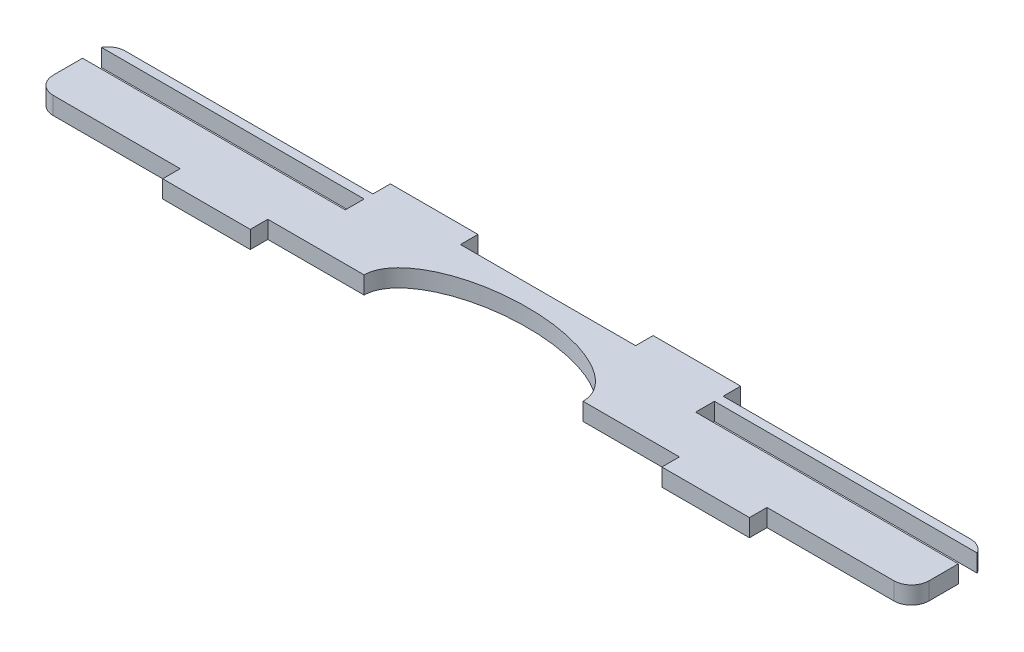
ISO-10303-21;
HEADER;
FILE_DESCRIPTION(('STEP AP214'),'2;1');
FILE_NAME('part.step','',(''),(''),'','','');
FILE_SCHEMA(('AUTOMOTIVE_DESIGN { 1 0 10303 214 1 1 1 1 }'));
ENDSEC;
DATA;
#1=APPLICATION_CONTEXT('core data for automotive mechanical design processes');
#2=APPLICATION_PROTOCOL_DEFINITION('international standard','automotive_design',2000,#1);
#3=PRODUCT_CONTEXT('',#1,'mechanical');
#4=PRODUCT('Part','Part','',(#3));
#5=PRODUCT_RELATED_PRODUCT_CATEGORY('part','',(#4));
#6=PRODUCT_DEFINITION_FORMATION('','',#4);
#7=PRODUCT_DEFINITION_CONTEXT('part definition',#1,'design');
#8=PRODUCT_DEFINITION('design','',#6,#7);
#9=PRODUCT_DEFINITION_SHAPE('','',#8);
#10=(LENGTH_UNIT() NAMED_UNIT(*) SI_UNIT(.MILLI.,.METRE.));
#11=(NAMED_UNIT(*) PLANE_ANGLE_UNIT() SI_UNIT($,.RADIAN.));
#12=(NAMED_UNIT(*) SI_UNIT($,.STERADIAN.) SOLID_ANGLE_UNIT());
#13=UNCERTAINTY_MEASURE_WITH_UNIT(LENGTH_MEASURE(1.E-05),#10,'distance_accuracy_value','');
#14=(GEOMETRIC_REPRESENTATION_CONTEXT(3) GLOBAL_UNCERTAINTY_ASSIGNED_CONTEXT((#13)) GLOBAL_UNIT_ASSIGNED_CONTEXT((#10,
#11,#12)) REPRESENTATION_CONTEXT('',''));
#15=CARTESIAN_POINT('',(0.,0.,0.));
#16=DIRECTION('',(0.,0.,1.));
#17=DIRECTION('',(1.,0.,0.));
#18=AXIS2_PLACEMENT_3D('',#15,#16,#17);
#19=CARTESIAN_POINT('',(-127.,5.08,10.795));
#20=DIRECTION('',(0.,0.,-1.));
#21=DIRECTION('',(-1.,0.,0.));
#22=AXIS2_PLACEMENT_3D('',#19,#20,#21);
#23=PLANE('',#22);
#24=DIRECTION('',(1.,0.,0.));
#25=VECTOR('',#24,1.);
#26=CARTESIAN_POINT('',(-127.,5.08,10.795));
#27=LINE('',#26,#25);
#28=CARTESIAN_POINT('',(85.09,5.08,10.795));
#29=VERTEX_POINT('',#28);
#30=CARTESIAN_POINT('',(121.92,5.08,10.795));
#31=VERTEX_POINT('',#30);
#32=EDGE_CURVE('E48',#29,#31,#27,.T.);
#33=ORIENTED_EDGE('',*,*,#32,.F.);
#34=DIRECTION('',(0.,-1.,0.));
#35=VECTOR('',#34,1.);
#36=CARTESIAN_POINT('',(85.09,5.08,10.795));
#37=LINE('',#36,#35);
#38=CARTESIAN_POINT('',(85.09,0.,10.795));
#39=VERTEX_POINT('',#38);
#40=EDGE_CURVE('E249',#29,#39,#37,.T.);
#41=ORIENTED_EDGE('',*,*,#40,.T.);
#42=DIRECTION('',(1.,0.,0.));
#43=VECTOR('',#42,1.);
#44=CARTESIAN_POINT('',(-127.,0.,10.795));
#45=LINE('',#44,#43);
#46=CARTESIAN_POINT('',(121.92,0.,10.795));
#47=VERTEX_POINT('',#46);
#48=EDGE_CURVE('E442',#39,#47,#45,.T.);
#49=ORIENTED_EDGE('',*,*,#48,.T.);
#50=DIRECTION('',(0.,-1.,0.));
#51=VECTOR('',#50,1.);
#52=CARTESIAN_POINT('',(121.92,5.08,10.795));
#53=LINE('',#52,#51);
#54=EDGE_CURVE('E510',#47,#31,#53,.F.);
#55=ORIENTED_EDGE('',*,*,#54,.T.);
#56=EDGE_LOOP('',(#33,#41,#49,#55));
#57=FACE_BOUND('',#56,.T.);
#58=ADVANCED_FACE('F33',(#57),#23,.F.);
#59=CARTESIAN_POINT('',(127.,5.08,10.795));
#60=DIRECTION('',(-1.,0.,0.));
#61=DIRECTION('',(0.,0.,1.));
#62=AXIS2_PLACEMENT_3D('',#59,#60,#61);
#63=PLANE('',#62);
#64=DIRECTION('',(0.,0.,-1.));
#65=VECTOR('',#64,1.);
#66=CARTESIAN_POINT('',(127.,5.08,10.795));
#67=LINE('',#66,#65);
#68=CARTESIAN_POINT('',(127.,5.08,5.715));
#69=VERTEX_POINT('',#68);
#70=CARTESIAN_POINT('',(127.,5.08,-2.794));
#71=VERTEX_POINT('',#70);
#72=EDGE_CURVE('E526',#69,#71,#67,.T.);
#73=ORIENTED_EDGE('',*,*,#72,.F.);
#74=DIRECTION('',(0.,-1.,0.));
#75=VECTOR('',#74,1.);
#76=CARTESIAN_POINT('',(127.,5.08,5.715));
#77=LINE('',#76,#75);
#78=CARTESIAN_POINT('',(127.,0.,5.715));
#79=VERTEX_POINT('',#78);
#80=EDGE_CURVE('E507',#69,#79,#77,.T.);
#81=ORIENTED_EDGE('',*,*,#80,.T.);
#82=DIRECTION('',(0.,0.,-1.));
#83=VECTOR('',#82,1.);
#84=CARTESIAN_POINT('',(127.,0.,10.795));
#85=LINE('',#84,#83);
#86=CARTESIAN_POINT('',(127.,0.,-2.794));
#87=VERTEX_POINT('',#86);
#88=EDGE_CURVE('E538',#79,#87,#85,.T.);
#89=ORIENTED_EDGE('',*,*,#88,.T.);
#90=DIRECTION('',(0.,1.,0.));
#91=VECTOR('',#90,1.);
#92=CARTESIAN_POINT('',(127.,0.,-2.794));
#93=LINE('',#92,#91);
#94=EDGE_CURVE('E296',#87,#71,#93,.T.);
#95=ORIENTED_EDGE('',*,*,#94,.T.);
#96=EDGE_LOOP('',(#73,#81,#89,#95));
#97=FACE_BOUND('',#96,.T.);
#98=ADVANCED_FACE('F387',(#97),#63,.F.);
#99=CARTESIAN_POINT('',(0.,5.08,0.));
#100=DIRECTION('',(0.,-1.,0.));
#101=DIRECTION('',(0.,0.,-1.));
#102=AXIS2_PLACEMENT_3D('',#99,#100,#101);
#103=PLANE('',#102);
#104=DIRECTION('',(1.,0.,0.));
#105=VECTOR('',#104,1.);
#106=CARTESIAN_POINT('',(127.,5.08,-8.255));
#107=LINE('',#106,#105);
#108=CARTESIAN_POINT('',(50.8,5.08,-8.255));
#109=VERTEX_POINT('',#108);
#110=CARTESIAN_POINT('',(127.,5.08,-8.255));
#111=VERTEX_POINT('',#110);
#112=EDGE_CURVE('E252',#109,#111,#107,.T.);
#113=ORIENTED_EDGE('',*,*,#112,.T.);
#114=CARTESIAN_POINT('',(122.600590948775,5.08,-5.715));
#115=DIRECTION('',(0.,-1.,0.));
#116=DIRECTION('',(0.,0.,-1.));
#117=AXIS2_PLACEMENT_3D('',#114,#115,#116);
#118=CIRCLE('',#117,5.08);
#119=CARTESIAN_POINT('',(122.600590948775,5.08,-10.795));
#120=VERTEX_POINT('',#119);
#121=EDGE_CURVE('E505',#111,#120,#118,.F.);
#122=ORIENTED_EDGE('',*,*,#121,.T.);
#123=DIRECTION('',(-1.,0.,0.));
#124=VECTOR('',#123,1.);
#125=CARTESIAN_POINT('',(-127.,5.08,-10.795));
#126=LINE('',#125,#124);
#127=CARTESIAN_POINT('',(50.8,5.08,-10.795));
#128=VERTEX_POINT('',#127);
#129=EDGE_CURVE('E546',#120,#128,#126,.T.);
#130=ORIENTED_EDGE('',*,*,#129,.T.);
#131=DIRECTION('',(0.,0.,1.));
#132=VECTOR('',#131,1.);
#133=CARTESIAN_POINT('',(50.8,5.07999999999999,-15.875));
#134=LINE('',#133,#132);
#135=CARTESIAN_POINT('',(50.8,5.07999999999999,-15.875));
#136=VERTEX_POINT('',#135);
#137=EDGE_CURVE('E608',#136,#128,#134,.T.);
#138=ORIENTED_EDGE('',*,*,#137,.F.);
#139=DIRECTION('',(-1.,0.,0.));
#140=VECTOR('',#139,1.);
#141=CARTESIAN_POINT('',(50.8,5.07999999999999,-15.875));
#142=LINE('',#141,#140);
#143=CARTESIAN_POINT('',(25.4,5.07999999999999,-15.875));
#144=VERTEX_POINT('',#143);
#145=EDGE_CURVE('E611',#136,#144,#142,.T.);
#146=ORIENTED_EDGE('',*,*,#145,.T.);
#147=DIRECTION('',(0.,0.,1.));
#148=VECTOR('',#147,1.);
#149=CARTESIAN_POINT('',(25.4,5.07999999999999,-15.875));
#150=LINE('',#149,#148);
#151=CARTESIAN_POINT('',(25.4,5.08,-10.795));
#152=VERTEX_POINT('',#151);
#153=EDGE_CURVE('E605',#144,#152,#150,.T.);
#154=ORIENTED_EDGE('',*,*,#153,.T.);
#155=CARTESIAN_POINT('',(-25.4,5.08,-10.795));
#156=VERTEX_POINT('',#155);
#157=EDGE_CURVE('E547',#152,#156,#126,.T.);
#158=ORIENTED_EDGE('',*,*,#157,.T.);
#159=DIRECTION('',(0.,0.,1.));
#160=VECTOR('',#159,1.);
#161=CARTESIAN_POINT('',(-25.4,5.07999999999999,-15.875));
#162=LINE('',#161,#160);
#163=CARTESIAN_POINT('',(-25.4,5.07999999999999,-15.875));
#164=VERTEX_POINT('',#163);
#165=EDGE_CURVE('E551',#164,#156,#162,.T.);
#166=ORIENTED_EDGE('',*,*,#165,.F.);
#167=DIRECTION('',(1.,0.,0.));
#168=VECTOR('',#167,1.);
#169=CARTESIAN_POINT('',(-50.8,5.07999999999999,-15.875));
#170=LINE('',#169,#168);
#171=CARTESIAN_POINT('',(-50.8,5.07999999999999,-15.875));
#172=VERTEX_POINT('',#171);
#173=EDGE_CURVE('E571',#172,#164,#170,.T.);
#174=ORIENTED_EDGE('',*,*,#173,.F.);
#175=DIRECTION('',(0.,0.,1.));
#176=VECTOR('',#175,1.);
#177=CARTESIAN_POINT('',(-50.8,5.07999999999999,-15.875));
#178=LINE('',#177,#176);
#179=CARTESIAN_POINT('',(-50.8,5.08,-10.795));
#180=VERTEX_POINT('',#179);
#181=EDGE_CURVE('E540',#172,#180,#178,.T.);
#182=ORIENTED_EDGE('',*,*,#181,.T.);
#183=CARTESIAN_POINT('',(-122.600590948775,5.08,-10.795));
#184=VERTEX_POINT('',#183);
#185=EDGE_CURVE('E527',#180,#184,#126,.T.);
#186=ORIENTED_EDGE('',*,*,#185,.T.);
#187=CARTESIAN_POINT('',(-122.600590948775,5.08,-5.715));
#188=DIRECTION('',(0.,-1.,0.));
#189=DIRECTION('',(0.,0.,-1.));
#190=AXIS2_PLACEMENT_3D('',#187,#188,#189);
#191=CIRCLE('',#190,5.08);
#192=CARTESIAN_POINT('',(-127.,5.08,-8.255));
#193=VERTEX_POINT('',#192);
#194=EDGE_CURVE('E482',#184,#193,#191,.F.);
#195=ORIENTED_EDGE('',*,*,#194,.T.);
#196=DIRECTION('',(-1.,0.,0.));
#197=VECTOR('',#196,1.);
#198=CARTESIAN_POINT('',(-127.,5.08,-8.255));
#199=LINE('',#198,#197);
#200=CARTESIAN_POINT('',(-50.8,5.08,-8.255));
#201=VERTEX_POINT('',#200);
#202=EDGE_CURVE('E309',#201,#193,#199,.T.);
#203=ORIENTED_EDGE('',*,*,#202,.F.);
#204=DIRECTION('',(0.,0.,-1.));
#205=VECTOR('',#204,1.);
#206=CARTESIAN_POINT('',(-50.8,5.08,-8.255));
#207=LINE('',#206,#205);
#208=CARTESIAN_POINT('',(-50.8,5.08,-2.794));
#209=VERTEX_POINT('',#208);
#210=EDGE_CURVE('E318',#209,#201,#207,.T.);
#211=ORIENTED_EDGE('',*,*,#210,.F.);
#212=DIRECTION('',(1.,0.,0.));
#213=VECTOR('',#212,1.);
#214=CARTESIAN_POINT('',(-127.,5.08,-2.794));
#215=LINE('',#214,#213);
#216=CARTESIAN_POINT('',(-127.,5.08,-2.794));
#217=VERTEX_POINT('',#216);
#218=EDGE_CURVE('E299',#217,#209,#215,.T.);
#219=ORIENTED_EDGE('',*,*,#218,.F.);
#220=DIRECTION('',(0.,0.,1.));
#221=VECTOR('',#220,1.);
#222=CARTESIAN_POINT('',(-127.,5.08,10.795));
#223=LINE('',#222,#221);
#224=CARTESIAN_POINT('',(-127.,5.08,5.715));
#225=VERTEX_POINT('',#224);
#226=EDGE_CURVE('E543',#217,#225,#223,.T.);
#227=ORIENTED_EDGE('',*,*,#226,.T.);
#228=CARTESIAN_POINT('',(-121.92,5.08,5.715));
#229=DIRECTION('',(0.,-1.,0.));
#230=DIRECTION('',(0.,0.,-1.));
#231=AXIS2_PLACEMENT_3D('',#228,#229,#230);
#232=CIRCLE('',#231,5.08);
#233=CARTESIAN_POINT('',(-121.92,5.08,10.795));
#234=VERTEX_POINT('',#233);
#235=EDGE_CURVE('E500',#225,#234,#232,.F.);
#236=ORIENTED_EDGE('',*,*,#235,.T.);
#237=CARTESIAN_POINT('',(-85.09,5.08,10.795));
#238=VERTEX_POINT('',#237);
#239=EDGE_CURVE('E519',#234,#238,#27,.T.);
#240=ORIENTED_EDGE('',*,*,#239,.T.);
#241=DIRECTION('',(0.,0.,-1.));
#242=VECTOR('',#241,1.);
#243=CARTESIAN_POINT('',(-85.09,5.08,15.875));
#244=LINE('',#243,#242);
#245=CARTESIAN_POINT('',(-85.09,5.08,15.875));
#246=VERTEX_POINT('',#245);
#247=EDGE_CURVE('E582',#246,#238,#244,.T.);
#248=ORIENTED_EDGE('',*,*,#247,.F.);
#249=DIRECTION('',(-1.,0.,0.));
#250=VECTOR('',#249,1.);
#251=CARTESIAN_POINT('',(-85.09,5.08,15.875));
#252=LINE('',#251,#250);
#253=CARTESIAN_POINT('',(-59.69,5.08,15.875));
#254=VERTEX_POINT('',#253);
#255=EDGE_CURVE('E585',#254,#246,#252,.T.);
#256=ORIENTED_EDGE('',*,*,#255,.F.);
#257=DIRECTION('',(0.,0.,-1.));
#258=VECTOR('',#257,1.);
#259=CARTESIAN_POINT('',(-59.69,5.08,15.875));
#260=LINE('',#259,#258);
#261=CARTESIAN_POINT('',(-59.69,5.08,10.795));
#262=VERTEX_POINT('',#261);
#263=EDGE_CURVE('E579',#254,#262,#260,.T.);
#264=ORIENTED_EDGE('',*,*,#263,.T.);
#265=CARTESIAN_POINT('',(-31.75,5.08,10.795));
#266=VERTEX_POINT('',#265);
#267=EDGE_CURVE('E542',#262,#266,#27,.T.);
#268=ORIENTED_EDGE('',*,*,#267,.T.);
#269=CARTESIAN_POINT('',(0.,5.08,10.795));
#270=DIRECTION('',(0.,1.,0.));
#271=DIRECTION('',(1.,0.,0.));
#272=AXIS2_PLACEMENT_3D('',#269,#270,#271);
#273=ELLIPSE('',#272,31.75,15.515530829024);
#274=CARTESIAN_POINT('',(31.75,5.08,10.795));
#275=VERTEX_POINT('',#274);
#276=EDGE_CURVE('E326',#275,#266,#273,.T.);
#277=ORIENTED_EDGE('',*,*,#276,.F.);
#278=CARTESIAN_POINT('',(59.69,5.08,10.795));
#279=VERTEX_POINT('',#278);
#280=EDGE_CURVE('E636',#275,#279,#27,.T.);
#281=ORIENTED_EDGE('',*,*,#280,.T.);
#282=DIRECTION('',(0.,0.,-1.));
#283=VECTOR('',#282,1.);
#284=CARTESIAN_POINT('',(59.69,5.08,15.875));
#285=LINE('',#284,#283);
#286=CARTESIAN_POINT('',(59.69,5.08,15.875));
#287=VERTEX_POINT('',#286);
#288=EDGE_CURVE('E253',#287,#279,#285,.T.);
#289=ORIENTED_EDGE('',*,*,#288,.F.);
#290=DIRECTION('',(1.,0.,0.));
#291=VECTOR('',#290,1.);
#292=CARTESIAN_POINT('',(85.09,5.08,15.875));
#293=LINE('',#292,#291);
#294=CARTESIAN_POINT('',(85.09,5.08,15.875));
#295=VERTEX_POINT('',#294);
#296=EDGE_CURVE('E259',#287,#295,#293,.T.);
#297=ORIENTED_EDGE('',*,*,#296,.T.);
#298=DIRECTION('',(0.,0.,-1.));
#299=VECTOR('',#298,1.);
#300=CARTESIAN_POINT('',(85.09,5.08,15.875));
#301=LINE('',#300,#299);
#302=EDGE_CURVE('E243',#295,#29,#301,.T.);
#303=ORIENTED_EDGE('',*,*,#302,.T.);
#304=ORIENTED_EDGE('',*,*,#32,.T.);
#305=CARTESIAN_POINT('',(121.92,5.08,5.715));
#306=DIRECTION('',(0.,-1.,0.));
#307=DIRECTION('',(0.,0.,-1.));
#308=AXIS2_PLACEMENT_3D('',#305,#306,#307);
#309=CIRCLE('',#308,5.08);
#310=EDGE_CURVE('E503',#31,#69,#309,.F.);
#311=ORIENTED_EDGE('',*,*,#310,.T.);
#312=ORIENTED_EDGE('',*,*,#72,.T.);
#313=DIRECTION('',(-1.,0.,0.));
#314=VECTOR('',#313,1.);
#315=CARTESIAN_POINT('',(127.,5.08,-2.794));
#316=LINE('',#315,#314);
#317=CARTESIAN_POINT('',(50.8,5.08,-2.794));
#318=VERTEX_POINT('',#317);
#319=EDGE_CURVE('E284',#71,#318,#316,.T.);
#320=ORIENTED_EDGE('',*,*,#319,.T.);
#321=DIRECTION('',(0.,0.,-1.));
#322=VECTOR('',#321,1.);
#323=CARTESIAN_POINT('',(50.8,5.08,-8.255));
#324=LINE('',#323,#322);
#325=EDGE_CURVE('E291',#318,#109,#324,.T.);
#326=ORIENTED_EDGE('',*,*,#325,.T.);
#327=EDGE_LOOP('',(#113,#122,#130,#138,#146,#154,#158,#166,#174,#182,#186,#195,#203,#211,#219,
#227,#236,#240,#248,#256,#264,#268,#277,#281,#289,#297,#303,#304,#311,#312,#320,#326));
#328=FACE_BOUND('',#327,.T.);
#329=ADVANCED_FACE('F265',(#328),#103,.F.);
#330=CARTESIAN_POINT('',(0.,0.,0.));
#331=DIRECTION('',(0.,-1.,0.));
#332=DIRECTION('',(0.,0.,-1.));
#333=AXIS2_PLACEMENT_3D('',#330,#331,#332);
#334=PLANE('',#333);
#335=DIRECTION('',(-1.,0.,0.));
#336=VECTOR('',#335,1.);
#337=CARTESIAN_POINT('',(-127.,0.,-10.795));
#338=LINE('',#337,#336);
#339=CARTESIAN_POINT('',(122.600590948775,0.,-10.795));
#340=VERTEX_POINT('',#339);
#341=CARTESIAN_POINT('',(50.8,0.,-10.795));
#342=VERTEX_POINT('',#341);
#343=EDGE_CURVE('E531',#340,#342,#338,.T.);
#344=ORIENTED_EDGE('',*,*,#343,.F.);
#345=CARTESIAN_POINT('',(122.600590948775,0.,-5.715));
#346=DIRECTION('',(0.,-1.,0.));
#347=DIRECTION('',(0.,0.,-1.));
#348=AXIS2_PLACEMENT_3D('',#345,#346,#347);
#349=CIRCLE('',#348,5.08);
#350=CARTESIAN_POINT('',(127.,0.,-8.255));
#351=VERTEX_POINT('',#350);
#352=EDGE_CURVE('E493',#340,#351,#349,.T.);
#353=ORIENTED_EDGE('',*,*,#352,.T.);
#354=DIRECTION('',(1.,0.,0.));
#355=VECTOR('',#354,1.);
#356=CARTESIAN_POINT('',(127.,0.,-8.255));
#357=LINE('',#356,#355);
#358=CARTESIAN_POINT('',(50.8,0.,-8.255));
#359=VERTEX_POINT('',#358);
#360=EDGE_CURVE('E280',#359,#351,#357,.T.);
#361=ORIENTED_EDGE('',*,*,#360,.F.);
#362=DIRECTION('',(0.,0.,-1.));
#363=VECTOR('',#362,1.);
#364=CARTESIAN_POINT('',(50.8,0.,-8.255));
#365=LINE('',#364,#363);
#366=CARTESIAN_POINT('',(50.8,0.,-2.794));
#367=VERTEX_POINT('',#366);
#368=EDGE_CURVE('E283',#367,#359,#365,.T.);
#369=ORIENTED_EDGE('',*,*,#368,.F.);
#370=DIRECTION('',(-1.,0.,0.));
#371=VECTOR('',#370,1.);
#372=CARTESIAN_POINT('',(127.,0.,-2.794));
#373=LINE('',#372,#371);
#374=EDGE_CURVE('E287',#87,#367,#373,.T.);
#375=ORIENTED_EDGE('',*,*,#374,.F.);
#376=ORIENTED_EDGE('',*,*,#88,.F.);
#377=CARTESIAN_POINT('',(121.92,0.,5.715));
#378=DIRECTION('',(0.,-1.,0.));
#379=DIRECTION('',(0.,0.,-1.));
#380=AXIS2_PLACEMENT_3D('',#377,#378,#379);
#381=CIRCLE('',#380,5.08);
#382=EDGE_CURVE('E489',#79,#47,#381,.T.);
#383=ORIENTED_EDGE('',*,*,#382,.T.);
#384=ORIENTED_EDGE('',*,*,#48,.F.);
#385=DIRECTION('',(0.,0.,-1.));
#386=VECTOR('',#385,1.);
#387=CARTESIAN_POINT('',(85.09,0.,15.875));
#388=LINE('',#387,#386);
#389=CARTESIAN_POINT('',(85.09,0.,15.875));
#390=VERTEX_POINT('',#389);
#391=EDGE_CURVE('E272',#390,#39,#388,.T.);
#392=ORIENTED_EDGE('',*,*,#391,.F.);
#393=DIRECTION('',(-1.,0.,0.));
#394=VECTOR('',#393,1.);
#395=CARTESIAN_POINT('',(85.09,0.,15.875));
#396=LINE('',#395,#394);
#397=CARTESIAN_POINT('',(59.69,0.,15.875));
#398=VERTEX_POINT('',#397);
#399=EDGE_CURVE('E262',#390,#398,#396,.T.);
#400=ORIENTED_EDGE('',*,*,#399,.T.);
#401=DIRECTION('',(0.,0.,-1.));
#402=VECTOR('',#401,1.);
#403=CARTESIAN_POINT('',(59.69,0.,15.875));
#404=LINE('',#403,#402);
#405=CARTESIAN_POINT('',(59.69,0.,10.795));
#406=VERTEX_POINT('',#405);
#407=EDGE_CURVE('E276',#398,#406,#404,.T.);
#408=ORIENTED_EDGE('',*,*,#407,.T.);
#409=CARTESIAN_POINT('',(31.75,0.,10.795));
#410=VERTEX_POINT('',#409);
#411=EDGE_CURVE('E440',#410,#406,#45,.T.);
#412=ORIENTED_EDGE('',*,*,#411,.F.);
#413=CARTESIAN_POINT('',(0.,0.,10.795));
#414=DIRECTION('',(0.,1.,0.));
#415=DIRECTION('',(1.,0.,0.));
#416=AXIS2_PLACEMENT_3D('',#413,#414,#415);
#417=ELLIPSE('',#416,31.75,15.515530829024);
#418=CARTESIAN_POINT('',(-31.75,0.,10.795));
#419=VERTEX_POINT('',#418);
#420=EDGE_CURVE('E332',#410,#419,#417,.T.);
#421=ORIENTED_EDGE('',*,*,#420,.T.);
#422=CARTESIAN_POINT('',(-59.69,0.,10.795));
#423=VERTEX_POINT('',#422);
#424=EDGE_CURVE('E441',#423,#419,#45,.T.);
#425=ORIENTED_EDGE('',*,*,#424,.F.);
#426=DIRECTION('',(0.,0.,-1.));
#427=VECTOR('',#426,1.);
#428=CARTESIAN_POINT('',(-59.69,0.,15.875));
#429=LINE('',#428,#427);
#430=CARTESIAN_POINT('',(-59.69,0.,15.875));
#431=VERTEX_POINT('',#430);
#432=EDGE_CURVE('E576',#431,#423,#429,.T.);
#433=ORIENTED_EDGE('',*,*,#432,.F.);
#434=DIRECTION('',(1.,0.,0.));
#435=VECTOR('',#434,1.);
#436=CARTESIAN_POINT('',(-85.09,0.,15.875));
#437=LINE('',#436,#435);
#438=CARTESIAN_POINT('',(-85.09,0.,15.875));
#439=VERTEX_POINT('',#438);
#440=EDGE_CURVE('E596',#439,#431,#437,.T.);
#441=ORIENTED_EDGE('',*,*,#440,.F.);
#442=DIRECTION('',(0.,0.,-1.));
#443=VECTOR('',#442,1.);
#444=CARTESIAN_POINT('',(-85.09,0.,15.875));
#445=LINE('',#444,#443);
#446=CARTESIAN_POINT('',(-85.09,0.,10.795));
#447=VERTEX_POINT('',#446);
#448=EDGE_CURVE('E524',#439,#447,#445,.T.);
#449=ORIENTED_EDGE('',*,*,#448,.T.);
#450=CARTESIAN_POINT('',(-121.92,0.,10.795));
#451=VERTEX_POINT('',#450);
#452=EDGE_CURVE('E517',#451,#447,#45,.T.);
#453=ORIENTED_EDGE('',*,*,#452,.F.);
#454=CARTESIAN_POINT('',(-121.92,0.,5.715));
#455=DIRECTION('',(0.,-1.,0.));
#456=DIRECTION('',(0.,0.,-1.));
#457=AXIS2_PLACEMENT_3D('',#454,#455,#456);
#458=CIRCLE('',#457,5.08);
#459=CARTESIAN_POINT('',(-127.,0.,5.715));
#460=VERTEX_POINT('',#459);
#461=EDGE_CURVE('E490',#451,#460,#458,.T.);
#462=ORIENTED_EDGE('',*,*,#461,.T.);
#463=DIRECTION('',(0.,0.,1.));
#464=VECTOR('',#463,1.);
#465=CARTESIAN_POINT('',(-127.,0.,10.795));
#466=LINE('',#465,#464);
#467=CARTESIAN_POINT('',(-127.,0.,-2.794));
#468=VERTEX_POINT('',#467);
#469=EDGE_CURVE('E530',#468,#460,#466,.T.);
#470=ORIENTED_EDGE('',*,*,#469,.F.);
#471=DIRECTION('',(1.,0.,0.));
#472=VECTOR('',#471,1.);
#473=CARTESIAN_POINT('',(-127.,0.,-2.794));
#474=LINE('',#473,#472);
#475=CARTESIAN_POINT('',(-50.8,0.,-2.794));
#476=VERTEX_POINT('',#475);
#477=EDGE_CURVE('E305',#468,#476,#474,.T.);
#478=ORIENTED_EDGE('',*,*,#477,.T.);
#479=DIRECTION('',(0.,0.,-1.));
#480=VECTOR('',#479,1.);
#481=CARTESIAN_POINT('',(-50.8,0.,-8.255));
#482=LINE('',#481,#480);
#483=CARTESIAN_POINT('',(-50.8,0.,-8.255));
#484=VERTEX_POINT('',#483);
#485=EDGE_CURVE('E308',#476,#484,#482,.T.);
#486=ORIENTED_EDGE('',*,*,#485,.T.);
#487=DIRECTION('',(-1.,0.,0.));
#488=VECTOR('',#487,1.);
#489=CARTESIAN_POINT('',(-127.,0.,-8.255));
#490=LINE('',#489,#488);
#491=CARTESIAN_POINT('',(-127.,0.,-8.255));
#492=VERTEX_POINT('',#491);
#493=EDGE_CURVE('E312',#484,#492,#490,.T.);
#494=ORIENTED_EDGE('',*,*,#493,.T.);
#495=CARTESIAN_POINT('',(-122.600590948775,0.,-5.715));
#496=DIRECTION('',(0.,-1.,0.));
#497=DIRECTION('',(0.,0.,-1.));
#498=AXIS2_PLACEMENT_3D('',#495,#496,#497);
#499=CIRCLE('',#498,5.08);
#500=CARTESIAN_POINT('',(-122.600590948775,0.,-10.795));
#501=VERTEX_POINT('',#500);
#502=EDGE_CURVE('E485',#492,#501,#499,.T.);
#503=ORIENTED_EDGE('',*,*,#502,.T.);
#504=CARTESIAN_POINT('',(-50.8,0.,-10.795));
#505=VERTEX_POINT('',#504);
#506=EDGE_CURVE('E536',#505,#501,#338,.T.);
#507=ORIENTED_EDGE('',*,*,#506,.F.);
#508=DIRECTION('',(0.,0.,1.));
#509=VECTOR('',#508,1.);
#510=CARTESIAN_POINT('',(-50.8,0.,-15.875));
#511=LINE('',#510,#509);
#512=CARTESIAN_POINT('',(-50.8,0.,-15.875));
#513=VERTEX_POINT('',#512);
#514=EDGE_CURVE('E557',#513,#505,#511,.T.);
#515=ORIENTED_EDGE('',*,*,#514,.F.);
#516=DIRECTION('',(-1.,0.,0.));
#517=VECTOR('',#516,1.);
#518=CARTESIAN_POINT('',(-50.8,0.,-15.875));
#519=LINE('',#518,#517);
#520=CARTESIAN_POINT('',(-25.4,0.,-15.875));
#521=VERTEX_POINT('',#520);
#522=EDGE_CURVE('E560',#521,#513,#519,.T.);
#523=ORIENTED_EDGE('',*,*,#522,.F.);
#524=DIRECTION('',(0.,0.,1.));
#525=VECTOR('',#524,1.);
#526=CARTESIAN_POINT('',(-25.4,0.,-15.875));
#527=LINE('',#526,#525);
#528=CARTESIAN_POINT('',(-25.4,0.,-10.795));
#529=VERTEX_POINT('',#528);
#530=EDGE_CURVE('E554',#521,#529,#527,.T.);
#531=ORIENTED_EDGE('',*,*,#530,.T.);
#532=CARTESIAN_POINT('',(25.4,0.,-10.795));
#533=VERTEX_POINT('',#532);
#534=EDGE_CURVE('E534',#533,#529,#338,.T.);
#535=ORIENTED_EDGE('',*,*,#534,.F.);
#536=DIRECTION('',(0.,0.,1.));
#537=VECTOR('',#536,1.);
#538=CARTESIAN_POINT('',(25.4,0.,-15.875));
#539=LINE('',#538,#537);
#540=CARTESIAN_POINT('',(25.4,0.,-15.875));
#541=VERTEX_POINT('',#540);
#542=EDGE_CURVE('E602',#541,#533,#539,.T.);
#543=ORIENTED_EDGE('',*,*,#542,.F.);
#544=DIRECTION('',(1.,0.,0.));
#545=VECTOR('',#544,1.);
#546=CARTESIAN_POINT('',(50.8,0.,-15.875));
#547=LINE('',#546,#545);
#548=CARTESIAN_POINT('',(50.8,0.,-15.875));
#549=VERTEX_POINT('',#548);
#550=EDGE_CURVE('E625',#541,#549,#547,.T.);
#551=ORIENTED_EDGE('',*,*,#550,.T.);
#552=DIRECTION('',(0.,0.,1.));
#553=VECTOR('',#552,1.);
#554=CARTESIAN_POINT('',(50.8,0.,-15.875));
#555=LINE('',#554,#553);
#556=EDGE_CURVE('E592',#549,#342,#555,.T.);
#557=ORIENTED_EDGE('',*,*,#556,.T.);
#558=EDGE_LOOP('',(#344,#353,#361,#369,#375,#376,#383,#384,#392,#400,#408,#412,#421,#425,#433,
#441,#449,#453,#462,#470,#478,#486,#494,#503,#507,#515,#523,#531,#535,#543,#551,#557));
#559=FACE_BOUND('',#558,.T.);
#560=ADVANCED_FACE('F386',(#559),#334,.T.);
#561=ORIENTED_EDGE('',*,*,#424,.T.);
#562=DIRECTION('',(0.,1.,0.));
#563=VECTOR('',#562,1.);
#564=CARTESIAN_POINT('',(-31.75,0.,10.795));
#565=LINE('',#564,#563);
#566=EDGE_CURVE('E619',#419,#266,#565,.T.);
#567=ORIENTED_EDGE('',*,*,#566,.T.);
#568=ORIENTED_EDGE('',*,*,#267,.F.);
#569=DIRECTION('',(0.,1.,0.));
#570=VECTOR('',#569,1.);
#571=CARTESIAN_POINT('',(-59.69,5.08,10.795));
#572=LINE('',#571,#570);
#573=EDGE_CURVE('E586',#423,#262,#572,.T.);
#574=ORIENTED_EDGE('',*,*,#573,.F.);
#575=EDGE_LOOP('',(#561,#567,#568,#574));
#576=FACE_BOUND('',#575,.T.);
#577=ADVANCED_FACE('F390',(#576),#23,.F.);
#578=CARTESIAN_POINT('',(-127.,5.08,-10.795));
#579=DIRECTION('',(0.,0.,1.));
#580=DIRECTION('',(1.,0.,0.));
#581=AXIS2_PLACEMENT_3D('',#578,#579,#580);
#582=PLANE('',#581);
#583=ORIENTED_EDGE('',*,*,#129,.F.);
#584=DIRECTION('',(0.,1.,0.));
#585=VECTOR('',#584,1.);
#586=CARTESIAN_POINT('',(122.600590948775,5.08,-10.795));
#587=LINE('',#586,#585);
#588=EDGE_CURVE('E495',#120,#340,#587,.F.);
#589=ORIENTED_EDGE('',*,*,#588,.T.);
#590=ORIENTED_EDGE('',*,*,#343,.T.);
#591=DIRECTION('',(0.,1.,0.));
#592=VECTOR('',#591,1.);
#593=CARTESIAN_POINT('',(50.8,5.07999999999999,-10.795));
#594=LINE('',#593,#592);
#595=EDGE_CURVE('E616',#342,#128,#594,.T.);
#596=ORIENTED_EDGE('',*,*,#595,.T.);
#597=EDGE_LOOP('',(#583,#589,#590,#596));
#598=FACE_BOUND('',#597,.T.);
#599=ADVANCED_FACE('F396',(#598),#582,.F.);
#600=ORIENTED_EDGE('',*,*,#239,.F.);
#601=DIRECTION('',(0.,-1.,0.));
#602=VECTOR('',#601,1.);
#603=CARTESIAN_POINT('',(-121.92,5.08,10.795));
#604=LINE('',#603,#602);
#605=EDGE_CURVE('E41',#234,#451,#604,.T.);
#606=ORIENTED_EDGE('',*,*,#605,.T.);
#607=ORIENTED_EDGE('',*,*,#452,.T.);
#608=DIRECTION('',(0.,-1.,0.));
#609=VECTOR('',#608,1.);
#610=CARTESIAN_POINT('',(-85.09,5.08,10.795));
#611=LINE('',#610,#609);
#612=EDGE_CURVE('E590',#238,#447,#611,.T.);
#613=ORIENTED_EDGE('',*,*,#612,.F.);
#614=EDGE_LOOP('',(#600,#606,#607,#613));
#615=FACE_BOUND('',#614,.T.);
#616=ADVANCED_FACE('F392',(#615),#23,.F.);
#617=ORIENTED_EDGE('',*,*,#411,.T.);
#618=DIRECTION('',(0.,1.,0.));
#619=VECTOR('',#618,1.);
#620=CARTESIAN_POINT('',(59.69,5.08,10.795));
#621=LINE('',#620,#619);
#622=EDGE_CURVE('E56',#406,#279,#621,.T.);
#623=ORIENTED_EDGE('',*,*,#622,.T.);
#624=ORIENTED_EDGE('',*,*,#280,.F.);
#625=DIRECTION('',(0.,1.,0.));
#626=VECTOR('',#625,1.);
#627=CARTESIAN_POINT('',(31.75,0.,10.795));
#628=LINE('',#627,#626);
#629=EDGE_CURVE('E336',#275,#410,#628,.F.);
#630=ORIENTED_EDGE('',*,*,#629,.T.);
#631=EDGE_LOOP('',(#617,#623,#624,#630));
#632=FACE_BOUND('',#631,.T.);
#633=ADVANCED_FACE('F395',(#632),#23,.F.);
#634=ORIENTED_EDGE('',*,*,#506,.T.);
#635=DIRECTION('',(0.,1.,0.));
#636=VECTOR('',#635,1.);
#637=CARTESIAN_POINT('',(-122.600590948775,5.08,-10.795));
#638=LINE('',#637,#636);
#639=EDGE_CURVE('E486',#501,#184,#638,.T.);
#640=ORIENTED_EDGE('',*,*,#639,.T.);
#641=ORIENTED_EDGE('',*,*,#185,.F.);
#642=DIRECTION('',(0.,1.,0.));
#643=VECTOR('',#642,1.);
#644=CARTESIAN_POINT('',(-50.8,5.07999999999999,-10.795));
#645=LINE('',#644,#643);
#646=EDGE_CURVE('E565',#505,#180,#645,.T.);
#647=ORIENTED_EDGE('',*,*,#646,.F.);
#648=EDGE_LOOP('',(#634,#640,#641,#647));
#649=FACE_BOUND('',#648,.T.);
#650=ADVANCED_FACE('F402',(#649),#582,.F.);
#651=ORIENTED_EDGE('',*,*,#157,.F.);
#652=DIRECTION('',(0.,-1.,0.));
#653=VECTOR('',#652,1.);
#654=CARTESIAN_POINT('',(25.4,5.07999999999999,-10.795));
#655=LINE('',#654,#653);
#656=EDGE_CURVE('E612',#152,#533,#655,.T.);
#657=ORIENTED_EDGE('',*,*,#656,.T.);
#658=ORIENTED_EDGE('',*,*,#534,.T.);
#659=DIRECTION('',(0.,-1.,0.));
#660=VECTOR('',#659,1.);
#661=CARTESIAN_POINT('',(-25.4,5.07999999999999,-10.795));
#662=LINE('',#661,#660);
#663=EDGE_CURVE('E561',#156,#529,#662,.T.);
#664=ORIENTED_EDGE('',*,*,#663,.F.);
#665=EDGE_LOOP('',(#651,#657,#658,#664));
#666=FACE_BOUND('',#665,.T.);
#667=ADVANCED_FACE('F400',(#666),#582,.F.);
#668=CARTESIAN_POINT('',(-127.,5.08,10.795));
#669=DIRECTION('',(1.,0.,0.));
#670=DIRECTION('',(0.,0.,-1.));
#671=AXIS2_PLACEMENT_3D('',#668,#669,#670);
#672=PLANE('',#671);
#673=ORIENTED_EDGE('',*,*,#469,.T.);
#674=DIRECTION('',(0.,-1.,0.));
#675=VECTOR('',#674,1.);
#676=CARTESIAN_POINT('',(-127.,5.08,5.715));
#677=LINE('',#676,#675);
#678=EDGE_CURVE('E11',#460,#225,#677,.F.);
#679=ORIENTED_EDGE('',*,*,#678,.T.);
#680=ORIENTED_EDGE('',*,*,#226,.F.);
#681=DIRECTION('',(0.,1.,0.));
#682=VECTOR('',#681,1.);
#683=CARTESIAN_POINT('',(-127.,0.,-2.794));
#684=LINE('',#683,#682);
#685=EDGE_CURVE('E315',#468,#217,#684,.T.);
#686=ORIENTED_EDGE('',*,*,#685,.F.);
#687=EDGE_LOOP('',(#673,#679,#680,#686));
#688=FACE_BOUND('',#687,.T.);
#689=ADVANCED_FACE('F382',(#688),#672,.F.);
#690=CARTESIAN_POINT('',(-50.8,5.07999999999999,-15.875));
#691=DIRECTION('',(1.,0.,0.));
#692=DIRECTION('',(0.,0.,-1.));
#693=AXIS2_PLACEMENT_3D('',#690,#691,#692);
#694=PLANE('',#693);
#695=ORIENTED_EDGE('',*,*,#646,.T.);
#696=ORIENTED_EDGE('',*,*,#181,.F.);
#697=DIRECTION('',(0.,1.,0.));
#698=VECTOR('',#697,1.);
#699=CARTESIAN_POINT('',(-50.8,5.07999999999999,-15.875));
#700=LINE('',#699,#698);
#701=EDGE_CURVE('E564',#513,#172,#700,.T.);
#702=ORIENTED_EDGE('',*,*,#701,.F.);
#703=ORIENTED_EDGE('',*,*,#514,.T.);
#704=EDGE_LOOP('',(#695,#696,#702,#703));
#705=FACE_BOUND('',#704,.T.);
#706=ADVANCED_FACE('F378',(#705),#694,.F.);
#707=CARTESIAN_POINT('',(-25.4,5.07999999999999,-15.875));
#708=DIRECTION('',(-1.,0.,0.));
#709=DIRECTION('',(0.,0.,1.));
#710=AXIS2_PLACEMENT_3D('',#707,#708,#709);
#711=PLANE('',#710);
#712=ORIENTED_EDGE('',*,*,#663,.T.);
#713=ORIENTED_EDGE('',*,*,#530,.F.);
#714=DIRECTION('',(0.,-1.,0.));
#715=VECTOR('',#714,1.);
#716=CARTESIAN_POINT('',(-25.4,5.07999999999999,-15.875));
#717=LINE('',#716,#715);
#718=EDGE_CURVE('E569',#164,#521,#717,.T.);
#719=ORIENTED_EDGE('',*,*,#718,.F.);
#720=ORIENTED_EDGE('',*,*,#165,.T.);
#721=EDGE_LOOP('',(#712,#713,#719,#720));
#722=FACE_BOUND('',#721,.T.);
#723=ADVANCED_FACE('F374',(#722),#711,.F.);
#724=CARTESIAN_POINT('',(0.,0.,-15.875));
#725=DIRECTION('',(0.,0.,1.));
#726=DIRECTION('',(1.,0.,0.));
#727=AXIS2_PLACEMENT_3D('',#724,#725,#726);
#728=PLANE('',#727);
#729=ORIENTED_EDGE('',*,*,#701,.T.);
#730=ORIENTED_EDGE('',*,*,#173,.T.);
#731=ORIENTED_EDGE('',*,*,#718,.T.);
#732=ORIENTED_EDGE('',*,*,#522,.T.);
#733=EDGE_LOOP('',(#729,#730,#731,#732));
#734=FACE_BOUND('',#733,.T.);
#735=ADVANCED_FACE('F370',(#734),#728,.F.);
#736=CARTESIAN_POINT('',(-85.09,5.08,15.875));
#737=DIRECTION('',(1.,0.,0.));
#738=DIRECTION('',(0.,0.,-1.));
#739=AXIS2_PLACEMENT_3D('',#736,#737,#738);
#740=PLANE('',#739);
#741=ORIENTED_EDGE('',*,*,#612,.T.);
#742=ORIENTED_EDGE('',*,*,#448,.F.);
#743=DIRECTION('',(0.,-1.,0.));
#744=VECTOR('',#743,1.);
#745=CARTESIAN_POINT('',(-85.09,5.08,15.875));
#746=LINE('',#745,#744);
#747=EDGE_CURVE('E589',#246,#439,#746,.T.);
#748=ORIENTED_EDGE('',*,*,#747,.F.);
#749=ORIENTED_EDGE('',*,*,#247,.T.);
#750=EDGE_LOOP('',(#741,#742,#748,#749));
#751=FACE_BOUND('',#750,.T.);
#752=ADVANCED_FACE('F366',(#751),#740,.F.);
#753=CARTESIAN_POINT('',(-59.69,5.08,15.875));
#754=DIRECTION('',(-1.,0.,0.));
#755=DIRECTION('',(0.,0.,1.));
#756=AXIS2_PLACEMENT_3D('',#753,#754,#755);
#757=PLANE('',#756);
#758=ORIENTED_EDGE('',*,*,#573,.T.);
#759=ORIENTED_EDGE('',*,*,#263,.F.);
#760=DIRECTION('',(0.,1.,0.));
#761=VECTOR('',#760,1.);
#762=CARTESIAN_POINT('',(-59.69,5.08,15.875));
#763=LINE('',#762,#761);
#764=EDGE_CURVE('E594',#431,#254,#763,.T.);
#765=ORIENTED_EDGE('',*,*,#764,.F.);
#766=ORIENTED_EDGE('',*,*,#432,.T.);
#767=EDGE_LOOP('',(#758,#759,#765,#766));
#768=FACE_BOUND('',#767,.T.);
#769=ADVANCED_FACE('F362',(#768),#757,.F.);
#770=CARTESIAN_POINT('',(0.,0.,15.875));
#771=DIRECTION('',(0.,0.,1.));
#772=DIRECTION('',(1.,0.,0.));
#773=AXIS2_PLACEMENT_3D('',#770,#771,#772);
#774=PLANE('',#773);
#775=ORIENTED_EDGE('',*,*,#747,.T.);
#776=ORIENTED_EDGE('',*,*,#440,.T.);
#777=ORIENTED_EDGE('',*,*,#764,.T.);
#778=ORIENTED_EDGE('',*,*,#255,.T.);
#779=EDGE_LOOP('',(#775,#776,#777,#778));
#780=FACE_BOUND('',#779,.T.);
#781=ADVANCED_FACE('F358',(#780),#774,.T.);
#782=CARTESIAN_POINT('',(50.8,5.07999999999999,-15.875));
#783=DIRECTION('',(1.,0.,0.));
#784=DIRECTION('',(0.,0.,-1.));
#785=AXIS2_PLACEMENT_3D('',#782,#783,#784);
#786=PLANE('',#785);
#787=ORIENTED_EDGE('',*,*,#595,.F.);
#788=ORIENTED_EDGE('',*,*,#556,.F.);
#789=DIRECTION('',(0.,1.,0.));
#790=VECTOR('',#789,1.);
#791=CARTESIAN_POINT('',(50.8,5.07999999999999,-15.875));
#792=LINE('',#791,#790);
#793=EDGE_CURVE('E615',#549,#136,#792,.T.);
#794=ORIENTED_EDGE('',*,*,#793,.T.);
#795=ORIENTED_EDGE('',*,*,#137,.T.);
#796=EDGE_LOOP('',(#787,#788,#794,#795));
#797=FACE_BOUND('',#796,.T.);
#798=ADVANCED_FACE('F354',(#797),#786,.T.);
#799=CARTESIAN_POINT('',(25.4,5.07999999999999,-15.875));
#800=DIRECTION('',(-1.,0.,0.));
#801=DIRECTION('',(0.,0.,1.));
#802=AXIS2_PLACEMENT_3D('',#799,#800,#801);
#803=PLANE('',#802);
#804=ORIENTED_EDGE('',*,*,#656,.F.);
#805=ORIENTED_EDGE('',*,*,#153,.F.);
#806=DIRECTION('',(0.,-1.,0.));
#807=VECTOR('',#806,1.);
#808=CARTESIAN_POINT('',(25.4,5.07999999999999,-15.875));
#809=LINE('',#808,#807);
#810=EDGE_CURVE('E622',#144,#541,#809,.T.);
#811=ORIENTED_EDGE('',*,*,#810,.T.);
#812=ORIENTED_EDGE('',*,*,#542,.T.);
#813=EDGE_LOOP('',(#804,#805,#811,#812));
#814=FACE_BOUND('',#813,.T.);
#815=ADVANCED_FACE('F350',(#814),#803,.T.);
#816=CARTESIAN_POINT('',(0.,0.,-15.875));
#817=DIRECTION('',(0.,0.,1.));
#818=DIRECTION('',(-1.,0.,0.));
#819=AXIS2_PLACEMENT_3D('',#816,#817,#818);
#820=PLANE('',#819);
#821=ORIENTED_EDGE('',*,*,#793,.F.);
#822=ORIENTED_EDGE('',*,*,#550,.F.);
#823=ORIENTED_EDGE('',*,*,#810,.F.);
#824=ORIENTED_EDGE('',*,*,#145,.F.);
#825=EDGE_LOOP('',(#821,#822,#823,#824));
#826=FACE_BOUND('',#825,.T.);
#827=ADVANCED_FACE('F344',(#826),#820,.F.);
#828=DIRECTION('',(0.,1.,0.));
#829=VECTOR('',#828,1.);
#830=SURFACE_OF_LINEAR_EXTRUSION('',#417,#829);
#831=ORIENTED_EDGE('',*,*,#420,.F.);
#832=ORIENTED_EDGE('',*,*,#629,.F.);
#833=ORIENTED_EDGE('',*,*,#276,.T.);
#834=ORIENTED_EDGE('',*,*,#566,.F.);
#835=EDGE_LOOP('',(#831,#832,#833,#834));
#836=FACE_BOUND('',#835,.T.);
#837=ADVANCED_FACE('F339',(#836),#830,.F.);
#838=CARTESIAN_POINT('',(-127.,0.,-8.255));
#839=DIRECTION('',(0.,0.,-1.));
#840=DIRECTION('',(-1.,0.,0.));
#841=AXIS2_PLACEMENT_3D('',#838,#839,#840);
#842=PLANE('',#841);
#843=ORIENTED_EDGE('',*,*,#202,.T.);
#844=DIRECTION('',(0.,1.,0.));
#845=VECTOR('',#844,1.);
#846=CARTESIAN_POINT('',(-127.,0.,-8.255));
#847=LINE('',#846,#845);
#848=EDGE_CURVE('E323',#492,#193,#847,.T.);
#849=ORIENTED_EDGE('',*,*,#848,.F.);
#850=ORIENTED_EDGE('',*,*,#493,.F.);
#851=DIRECTION('',(0.,1.,0.));
#852=VECTOR('',#851,1.);
#853=CARTESIAN_POINT('',(-50.8,0.,-8.255));
#854=LINE('',#853,#852);
#855=EDGE_CURVE('E327',#484,#201,#854,.T.);
#856=ORIENTED_EDGE('',*,*,#855,.T.);
#857=EDGE_LOOP('',(#843,#849,#850,#856));
#858=FACE_BOUND('',#857,.T.);
#859=ADVANCED_FACE('F343',(#858),#842,.F.);
#860=CARTESIAN_POINT('',(-50.8,0.,-8.255));
#861=DIRECTION('',(1.,0.,0.));
#862=DIRECTION('',(0.,0.,-1.));
#863=AXIS2_PLACEMENT_3D('',#860,#861,#862);
#864=PLANE('',#863);
#865=ORIENTED_EDGE('',*,*,#210,.T.);
#866=ORIENTED_EDGE('',*,*,#855,.F.);
#867=ORIENTED_EDGE('',*,*,#485,.F.);
#868=DIRECTION('',(0.,1.,0.));
#869=VECTOR('',#868,1.);
#870=CARTESIAN_POINT('',(-50.8,0.,-2.794));
#871=LINE('',#870,#869);
#872=EDGE_CURVE('E329',#476,#209,#871,.T.);
#873=ORIENTED_EDGE('',*,*,#872,.T.);
#874=EDGE_LOOP('',(#865,#866,#867,#873));
#875=FACE_BOUND('',#874,.T.);
#876=ADVANCED_FACE('F468',(#875),#864,.F.);
#877=CARTESIAN_POINT('',(-127.,0.,-2.794));
#878=DIRECTION('',(0.,0.,1.));
#879=DIRECTION('',(1.,0.,0.));
#880=AXIS2_PLACEMENT_3D('',#877,#878,#879);
#881=PLANE('',#880);
#882=ORIENTED_EDGE('',*,*,#218,.T.);
#883=ORIENTED_EDGE('',*,*,#872,.F.);
#884=ORIENTED_EDGE('',*,*,#477,.F.);
#885=ORIENTED_EDGE('',*,*,#685,.T.);
#886=EDGE_LOOP('',(#882,#883,#884,#885));
#887=FACE_BOUND('',#886,.T.);
#888=ADVANCED_FACE('F346',(#887),#881,.F.);
#889=CARTESIAN_POINT('',(127.,0.,-2.794));
#890=DIRECTION('',(0.,0.,-1.));
#891=DIRECTION('',(-1.,0.,0.));
#892=AXIS2_PLACEMENT_3D('',#889,#890,#891);
#893=PLANE('',#892);
#894=ORIENTED_EDGE('',*,*,#319,.F.);
#895=ORIENTED_EDGE('',*,*,#94,.F.);
#896=ORIENTED_EDGE('',*,*,#374,.T.);
#897=DIRECTION('',(0.,1.,0.));
#898=VECTOR('',#897,1.);
#899=CARTESIAN_POINT('',(50.8,0.,-2.794));
#900=LINE('',#899,#898);
#901=EDGE_CURVE('E300',#367,#318,#900,.T.);
#902=ORIENTED_EDGE('',*,*,#901,.T.);
#903=EDGE_LOOP('',(#894,#895,#896,#902));
#904=FACE_BOUND('',#903,.T.);
#905=ADVANCED_FACE('F456',(#904),#893,.T.);
#906=CARTESIAN_POINT('',(50.8,0.,-8.255));
#907=DIRECTION('',(1.,0.,0.));
#908=DIRECTION('',(0.,0.,-1.));
#909=AXIS2_PLACEMENT_3D('',#906,#907,#908);
#910=PLANE('',#909);
#911=ORIENTED_EDGE('',*,*,#325,.F.);
#912=ORIENTED_EDGE('',*,*,#901,.F.);
#913=ORIENTED_EDGE('',*,*,#368,.T.);
#914=DIRECTION('',(0.,1.,0.));
#915=VECTOR('',#914,1.);
#916=CARTESIAN_POINT('',(50.8,0.,-8.255));
#917=LINE('',#916,#915);
#918=EDGE_CURVE('E302',#359,#109,#917,.T.);
#919=ORIENTED_EDGE('',*,*,#918,.T.);
#920=EDGE_LOOP('',(#911,#912,#913,#919));
#921=FACE_BOUND('',#920,.T.);
#922=ADVANCED_FACE('F459',(#921),#910,.T.);
#923=CARTESIAN_POINT('',(127.,0.,-8.255));
#924=DIRECTION('',(0.,0.,1.));
#925=DIRECTION('',(1.,0.,0.));
#926=AXIS2_PLACEMENT_3D('',#923,#924,#925);
#927=PLANE('',#926);
#928=ORIENTED_EDGE('',*,*,#112,.F.);
#929=ORIENTED_EDGE('',*,*,#918,.F.);
#930=ORIENTED_EDGE('',*,*,#360,.T.);
#931=DIRECTION('',(0.,1.,0.));
#932=VECTOR('',#931,1.);
#933=CARTESIAN_POINT('',(127.,0.,-8.255));
#934=LINE('',#933,#932);
#935=EDGE_CURVE('E289',#351,#111,#934,.T.);
#936=ORIENTED_EDGE('',*,*,#935,.T.);
#937=EDGE_LOOP('',(#928,#929,#930,#936));
#938=FACE_BOUND('',#937,.T.);
#939=ADVANCED_FACE('F413',(#938),#927,.T.);
#940=CARTESIAN_POINT('',(122.600590948775,5.08,-5.715));
#941=DIRECTION('',(0.,1.,0.));
#942=DIRECTION('',(0.,0.,1.));
#943=AXIS2_PLACEMENT_3D('',#940,#941,#942);
#944=CYLINDRICAL_SURFACE('',#943,5.08);
#945=ORIENTED_EDGE('',*,*,#121,.F.);
#946=ORIENTED_EDGE('',*,*,#935,.F.);
#947=ORIENTED_EDGE('',*,*,#352,.F.);
#948=ORIENTED_EDGE('',*,*,#588,.F.);
#949=EDGE_LOOP('',(#945,#946,#947,#948));
#950=FACE_BOUND('',#949,.T.);
#951=ADVANCED_FACE('F409',(#950),#944,.T.);
#952=CARTESIAN_POINT('',(121.92,5.08,5.715));
#953=DIRECTION('',(0.,-1.,0.));
#954=DIRECTION('',(0.,0.,-1.));
#955=AXIS2_PLACEMENT_3D('',#952,#953,#954);
#956=CYLINDRICAL_SURFACE('',#955,5.08);
#957=ORIENTED_EDGE('',*,*,#310,.F.);
#958=ORIENTED_EDGE('',*,*,#54,.F.);
#959=ORIENTED_EDGE('',*,*,#382,.F.);
#960=ORIENTED_EDGE('',*,*,#80,.F.);
#961=EDGE_LOOP('',(#957,#958,#959,#960));
#962=FACE_BOUND('',#961,.T.);
#963=ADVANCED_FACE('F412',(#962),#956,.T.);
#964=CARTESIAN_POINT('',(-122.600590948775,5.08,-5.715));
#965=DIRECTION('',(0.,1.,0.));
#966=DIRECTION('',(0.,0.,1.));
#967=AXIS2_PLACEMENT_3D('',#964,#965,#966);
#968=CYLINDRICAL_SURFACE('',#967,5.08);
#969=ORIENTED_EDGE('',*,*,#194,.F.);
#970=ORIENTED_EDGE('',*,*,#639,.F.);
#971=ORIENTED_EDGE('',*,*,#502,.F.);
#972=ORIENTED_EDGE('',*,*,#848,.T.);
#973=EDGE_LOOP('',(#969,#970,#971,#972));
#974=FACE_BOUND('',#973,.T.);
#975=ADVANCED_FACE('F416',(#974),#968,.T.);
#976=CARTESIAN_POINT('',(-121.92,5.08,5.715));
#977=DIRECTION('',(0.,-1.,0.));
#978=DIRECTION('',(0.,0.,-1.));
#979=AXIS2_PLACEMENT_3D('',#976,#977,#978);
#980=CYLINDRICAL_SURFACE('',#979,5.08);
#981=ORIENTED_EDGE('',*,*,#235,.F.);
#982=ORIENTED_EDGE('',*,*,#678,.F.);
#983=ORIENTED_EDGE('',*,*,#461,.F.);
#984=ORIENTED_EDGE('',*,*,#605,.F.);
#985=EDGE_LOOP('',(#981,#982,#983,#984));
#986=FACE_BOUND('',#985,.T.);
#987=ADVANCED_FACE('F35',(#986),#980,.T.);
#988=CARTESIAN_POINT('',(85.09,5.08,15.875));
#989=DIRECTION('',(1.,0.,0.));
#990=DIRECTION('',(0.,0.,-1.));
#991=AXIS2_PLACEMENT_3D('',#988,#989,#990);
#992=PLANE('',#991);
#993=ORIENTED_EDGE('',*,*,#40,.F.);
#994=ORIENTED_EDGE('',*,*,#302,.F.);
#995=DIRECTION('',(0.,-1.,0.));
#996=VECTOR('',#995,1.);
#997=CARTESIAN_POINT('',(85.09,5.08,15.875));
#998=LINE('',#997,#996);
#999=EDGE_CURVE('E247',#295,#390,#998,.T.);
#1000=ORIENTED_EDGE('',*,*,#999,.T.);
#1001=ORIENTED_EDGE('',*,*,#391,.T.);
#1002=EDGE_LOOP('',(#993,#994,#1000,#1001));
#1003=FACE_BOUND('',#1002,.T.);
#1004=ADVANCED_FACE('F245',(#1003),#992,.T.);
#1005=CARTESIAN_POINT('',(59.69,5.08,15.875));
#1006=DIRECTION('',(-1.,0.,0.));
#1007=DIRECTION('',(0.,0.,1.));
#1008=AXIS2_PLACEMENT_3D('',#1005,#1006,#1007);
#1009=PLANE('',#1008);
#1010=ORIENTED_EDGE('',*,*,#622,.F.);
#1011=ORIENTED_EDGE('',*,*,#407,.F.);
#1012=DIRECTION('',(0.,1.,0.));
#1013=VECTOR('',#1012,1.);
#1014=CARTESIAN_POINT('',(59.69,5.08,15.875));
#1015=LINE('',#1014,#1013);
#1016=EDGE_CURVE('E267',#398,#287,#1015,.T.);
#1017=ORIENTED_EDGE('',*,*,#1016,.T.);
#1018=ORIENTED_EDGE('',*,*,#288,.T.);
#1019=EDGE_LOOP('',(#1010,#1011,#1017,#1018));
#1020=FACE_BOUND('',#1019,.T.);
#1021=ADVANCED_FACE('F446',(#1020),#1009,.T.);
#1022=CARTESIAN_POINT('',(0.,0.,15.875));
#1023=DIRECTION('',(0.,0.,1.));
#1024=DIRECTION('',(-1.,0.,0.));
#1025=AXIS2_PLACEMENT_3D('',#1022,#1023,#1024);
#1026=PLANE('',#1025);
#1027=ORIENTED_EDGE('',*,*,#999,.F.);
#1028=ORIENTED_EDGE('',*,*,#296,.F.);
#1029=ORIENTED_EDGE('',*,*,#1016,.F.);
#1030=ORIENTED_EDGE('',*,*,#399,.F.);
#1031=EDGE_LOOP('',(#1027,#1028,#1029,#1030));
#1032=FACE_BOUND('',#1031,.T.);
#1033=ADVANCED_FACE('F257',(#1032),#1026,.T.);
#1034=CLOSED_SHELL('',(#58,#98,#329,#560,#577,#599,#616,#633,#650,#667,#689,#706,#723,#735,#752,
#769,#781,#798,#815,#827,#837,#859,#876,#888,#905,#922,#939,#951,#963,#975,#987,#1004,#1021,#1033));
#1035=MANIFOLD_SOLID_BREP('B2',#1034);
#1036=ADVANCED_BREP_SHAPE_REPRESENTATION('',(#18,#1035),#14);
#1037=SHAPE_DEFINITION_REPRESENTATION(#9,#1036);
ENDSEC;
END-ISO-10303-21;
